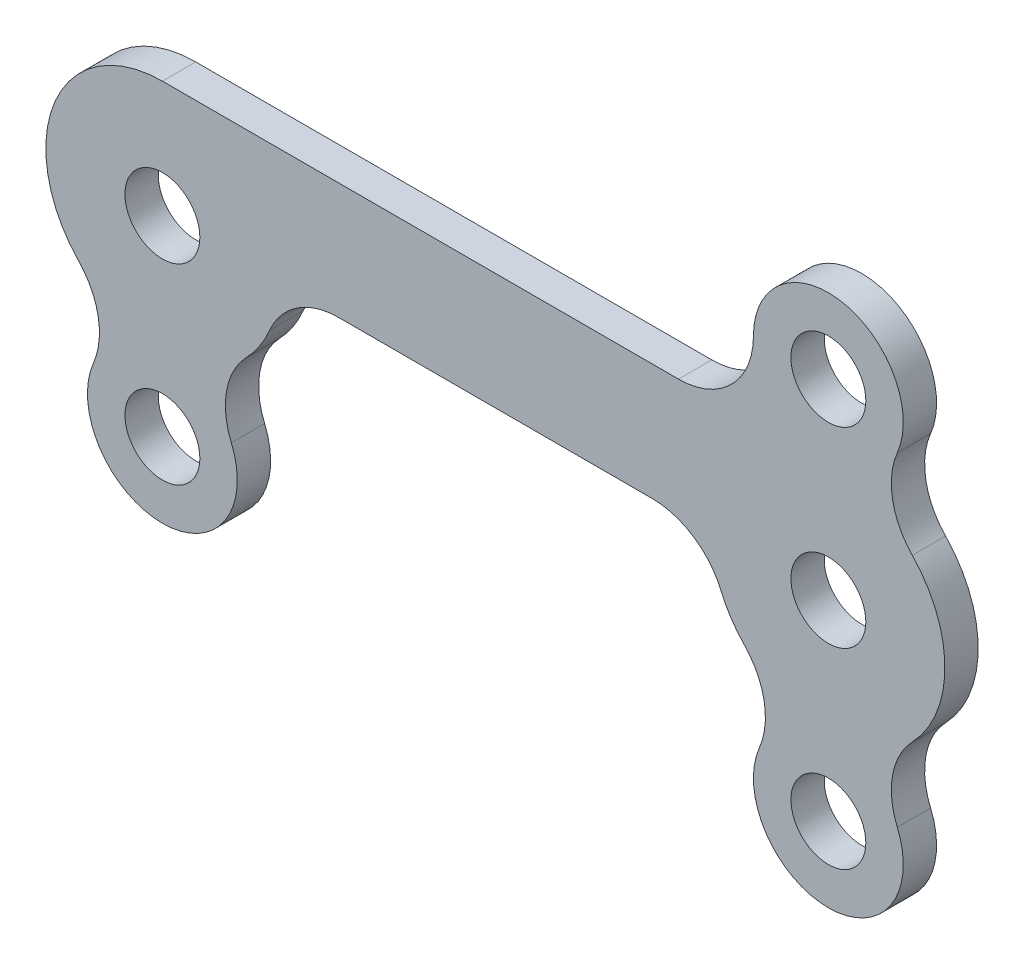
ISO-10303-21;
HEADER;
FILE_DESCRIPTION(('STEP AP214'),'2;1');
FILE_NAME('part.step','',(''),(''),'','','');
FILE_SCHEMA(('AUTOMOTIVE_DESIGN { 1 0 10303 214 1 1 1 1 }'));
ENDSEC;
DATA;
#1=APPLICATION_CONTEXT('core data for automotive mechanical design processes');
#2=APPLICATION_PROTOCOL_DEFINITION('international standard','automotive_design',2000,#1);
#3=PRODUCT_CONTEXT('',#1,'mechanical');
#4=PRODUCT('Part','Part','',(#3));
#5=PRODUCT_RELATED_PRODUCT_CATEGORY('part','',(#4));
#6=PRODUCT_DEFINITION_FORMATION('','',#4);
#7=PRODUCT_DEFINITION_CONTEXT('part definition',#1,'design');
#8=PRODUCT_DEFINITION('design','',#6,#7);
#9=PRODUCT_DEFINITION_SHAPE('','',#8);
#10=(LENGTH_UNIT() NAMED_UNIT(*) SI_UNIT(.MILLI.,.METRE.));
#11=(NAMED_UNIT(*) PLANE_ANGLE_UNIT() SI_UNIT($,.RADIAN.));
#12=(NAMED_UNIT(*) SI_UNIT($,.STERADIAN.) SOLID_ANGLE_UNIT());
#13=UNCERTAINTY_MEASURE_WITH_UNIT(LENGTH_MEASURE(1.E-05),#10,'distance_accuracy_value','');
#14=(GEOMETRIC_REPRESENTATION_CONTEXT(3) GLOBAL_UNCERTAINTY_ASSIGNED_CONTEXT((#13)) GLOBAL_UNIT_ASSIGNED_CONTEXT((#10,
#11,#12)) REPRESENTATION_CONTEXT('',''));
#15=CARTESIAN_POINT('',(0.,0.,0.));
#16=DIRECTION('',(0.,0.,1.));
#17=DIRECTION('',(1.,0.,0.));
#18=AXIS2_PLACEMENT_3D('',#15,#16,#17);
#19=CARTESIAN_POINT('',(38.324116844667,6.33274456521739,1.5875));
#20=DIRECTION('',(0.,0.,-1.));
#21=DIRECTION('',(-1.,0.,0.));
#22=AXIS2_PLACEMENT_3D('',#19,#20,#21);
#23=CYLINDRICAL_SURFACE('',#22,3.571875);
#24=CARTESIAN_POINT('',(38.324116844667,6.33274456521739,0.));
#25=DIRECTION('',(0.,0.,1.));
#26=DIRECTION('',(1.,0.,0.));
#27=AXIS2_PLACEMENT_3D('',#24,#25,#26);
#28=CIRCLE('',#27,3.571875);
#29=CARTESIAN_POINT('',(35.0370584223335,7.7304347826087,0.));
#30=VERTEX_POINT('',#29);
#31=CARTESIAN_POINT('',(35.7516363402321,3.8547140831758,0.));
#32=VERTEX_POINT('',#31);
#33=EDGE_CURVE('E166',#30,#32,#28,.T.);
#34=ORIENTED_EDGE('',*,*,#33,.F.);
#35=DIRECTION('',(0.,0.,-1.));
#36=VECTOR('',#35,1.);
#37=CARTESIAN_POINT('',(35.0370584223335,7.7304347826087,1.5875));
#38=LINE('',#37,#36);
#39=CARTESIAN_POINT('',(35.0370584223335,7.7304347826087,1.5875));
#40=VERTEX_POINT('',#39);
#41=EDGE_CURVE('E161',#40,#30,#38,.T.);
#42=ORIENTED_EDGE('',*,*,#41,.F.);
#43=CARTESIAN_POINT('',(38.324116844667,6.33274456521739,1.5875));
#44=DIRECTION('',(0.,0.,1.));
#45=DIRECTION('',(1.,0.,0.));
#46=AXIS2_PLACEMENT_3D('',#43,#44,#45);
#47=CIRCLE('',#46,3.571875);
#48=CARTESIAN_POINT('',(35.7516363402321,3.8547140831758,1.5875));
#49=VERTEX_POINT('',#48);
#50=EDGE_CURVE('E164',#40,#49,#47,.T.);
#51=ORIENTED_EDGE('',*,*,#50,.T.);
#52=DIRECTION('',(0.,0.,-1.));
#53=VECTOR('',#52,1.);
#54=CARTESIAN_POINT('',(35.7516363402321,3.8547140831758,1.5875));
#55=LINE('',#54,#53);
#56=EDGE_CURVE('E256',#49,#32,#55,.T.);
#57=ORIENTED_EDGE('',*,*,#56,.T.);
#58=EDGE_LOOP('',(#34,#42,#51,#57));
#59=FACE_BOUND('',#58,.T.);
#60=ADVANCED_FACE('F41',(#59),#23,.F.);
#61=CARTESIAN_POINT('',(31.75,9.128125,1.5875));
#62=DIRECTION('',(0.,0.,-1.));
#63=DIRECTION('',(-1.,0.,0.));
#64=AXIS2_PLACEMENT_3D('',#61,#62,#63);
#65=CYLINDRICAL_SURFACE('',#64,3.57187499999999);
#66=CARTESIAN_POINT('',(31.75,9.128125,0.));
#67=DIRECTION('',(0.,0.,1.));
#68=DIRECTION('',(1.,0.,0.));
#69=AXIS2_PLACEMENT_3D('',#66,#67,#68);
#70=CIRCLE('',#69,3.57187499999999);
#71=CARTESIAN_POINT('',(28.178125,9.128125,0.));
#72=VERTEX_POINT('',#71);
#73=EDGE_CURVE('E259',#30,#72,#70,.T.);
#74=ORIENTED_EDGE('',*,*,#73,.T.);
#75=DIRECTION('',(0.,0.,-1.));
#76=VECTOR('',#75,1.);
#77=CARTESIAN_POINT('',(28.178125,9.128125,1.5875));
#78=LINE('',#77,#76);
#79=CARTESIAN_POINT('',(28.178125,9.128125,1.5875));
#80=VERTEX_POINT('',#79);
#81=EDGE_CURVE('E172',#80,#72,#78,.T.);
#82=ORIENTED_EDGE('',*,*,#81,.F.);
#83=CARTESIAN_POINT('',(31.75,9.128125,1.5875));
#84=DIRECTION('',(0.,0.,1.));
#85=DIRECTION('',(1.,0.,0.));
#86=AXIS2_PLACEMENT_3D('',#83,#84,#85);
#87=CIRCLE('',#86,3.57187499999999);
#88=EDGE_CURVE('E175',#40,#80,#87,.T.);
#89=ORIENTED_EDGE('',*,*,#88,.F.);
#90=ORIENTED_EDGE('',*,*,#41,.T.);
#91=EDGE_LOOP('',(#74,#82,#89,#90));
#92=FACE_BOUND('',#91,.T.);
#93=ADVANCED_FACE('F176',(#92),#65,.T.);
#94=CARTESIAN_POINT('',(24.60625,9.128125,1.5875));
#95=DIRECTION('',(0.,0.,-1.));
#96=DIRECTION('',(-1.,0.,0.));
#97=AXIS2_PLACEMENT_3D('',#94,#95,#96);
#98=CYLINDRICAL_SURFACE('',#97,3.571875);
#99=CARTESIAN_POINT('',(24.60625,9.128125,0.));
#100=DIRECTION('',(0.,0.,1.));
#101=DIRECTION('',(1.,0.,0.));
#102=AXIS2_PLACEMENT_3D('',#99,#100,#101);
#103=CIRCLE('',#102,3.571875);
#104=CARTESIAN_POINT('',(24.60625,5.55625,0.));
#105=VERTEX_POINT('',#104);
#106=EDGE_CURVE('E262',#105,#72,#103,.T.);
#107=ORIENTED_EDGE('',*,*,#106,.F.);
#108=DIRECTION('',(0.,0.,-1.));
#109=VECTOR('',#108,1.);
#110=CARTESIAN_POINT('',(24.60625,5.55625,1.5875));
#111=LINE('',#110,#109);
#112=CARTESIAN_POINT('',(24.60625,5.55625,1.5875));
#113=VERTEX_POINT('',#112);
#114=EDGE_CURVE('E352',#113,#105,#111,.T.);
#115=ORIENTED_EDGE('',*,*,#114,.F.);
#116=CARTESIAN_POINT('',(24.60625,9.128125,1.5875));
#117=DIRECTION('',(0.,0.,1.));
#118=DIRECTION('',(1.,0.,0.));
#119=AXIS2_PLACEMENT_3D('',#116,#117,#118);
#120=CIRCLE('',#119,3.571875);
#121=EDGE_CURVE('E181',#113,#80,#120,.T.);
#122=ORIENTED_EDGE('',*,*,#121,.T.);
#123=ORIENTED_EDGE('',*,*,#81,.T.);
#124=EDGE_LOOP('',(#107,#115,#122,#123));
#125=FACE_BOUND('',#124,.T.);
#126=ADVANCED_FACE('F417',(#125),#98,.F.);
#127=CARTESIAN_POINT('',(0.,5.55625,1.5875));
#128=DIRECTION('',(0.,1.,0.));
#129=DIRECTION('',(0.,0.,1.));
#130=AXIS2_PLACEMENT_3D('',#127,#128,#129);
#131=PLANE('',#130);
#132=DIRECTION('',(1.,0.,0.));
#133=VECTOR('',#132,1.);
#134=CARTESIAN_POINT('',(0.,5.55625,0.));
#135=LINE('',#134,#133);
#136=CARTESIAN_POINT('',(0.,5.55625,0.));
#137=VERTEX_POINT('',#136);
#138=EDGE_CURVE('E266',#137,#105,#135,.T.);
#139=ORIENTED_EDGE('',*,*,#138,.F.);
#140=DIRECTION('',(0.,0.,-1.));
#141=VECTOR('',#140,1.);
#142=CARTESIAN_POINT('',(0.,5.55625,1.5875));
#143=LINE('',#142,#141);
#144=CARTESIAN_POINT('',(0.,5.55625,1.5875));
#145=VERTEX_POINT('',#144);
#146=EDGE_CURVE('E349',#145,#137,#143,.T.);
#147=ORIENTED_EDGE('',*,*,#146,.F.);
#148=DIRECTION('',(1.,0.,0.));
#149=VECTOR('',#148,1.);
#150=CARTESIAN_POINT('',(0.,5.55625,1.5875));
#151=LINE('',#150,#149);
#152=EDGE_CURVE('E199',#145,#113,#151,.T.);
#153=ORIENTED_EDGE('',*,*,#152,.T.);
#154=ORIENTED_EDGE('',*,*,#114,.T.);
#155=EDGE_LOOP('',(#139,#147,#153,#154));
#156=FACE_BOUND('',#155,.T.);
#157=ADVANCED_FACE('F420',(#156),#131,.T.);
#158=CARTESIAN_POINT('',(0.,0.,1.5875));
#159=DIRECTION('',(0.,0.,-1.));
#160=DIRECTION('',(-1.,0.,0.));
#161=AXIS2_PLACEMENT_3D('',#158,#159,#160);
#162=CYLINDRICAL_SURFACE('',#161,5.55625);
#163=CARTESIAN_POINT('',(0.,0.,0.));
#164=DIRECTION('',(0.,0.,1.));
#165=DIRECTION('',(1.,0.,0.));
#166=AXIS2_PLACEMENT_3D('',#163,#164,#165);
#167=CIRCLE('',#166,5.55625);
#168=CARTESIAN_POINT('',(-4.0016363402321,-3.85471408317581,0.));
#169=VERTEX_POINT('',#168);
#170=EDGE_CURVE('E270',#137,#169,#167,.T.);
#171=ORIENTED_EDGE('',*,*,#170,.T.);
#172=DIRECTION('',(0.,0.,-1.));
#173=VECTOR('',#172,1.);
#174=CARTESIAN_POINT('',(-4.0016363402321,-3.85471408317581,1.5875));
#175=LINE('',#174,#173);
#176=CARTESIAN_POINT('',(-4.0016363402321,-3.85471408317581,1.5875));
#177=VERTEX_POINT('',#176);
#178=EDGE_CURVE('E346',#177,#169,#175,.T.);
#179=ORIENTED_EDGE('',*,*,#178,.F.);
#180=CARTESIAN_POINT('',(0.,0.,1.5875));
#181=DIRECTION('',(0.,0.,1.));
#182=DIRECTION('',(1.,0.,0.));
#183=AXIS2_PLACEMENT_3D('',#180,#181,#182);
#184=CIRCLE('',#183,5.55625);
#185=EDGE_CURVE('E203',#145,#177,#184,.T.);
#186=ORIENTED_EDGE('',*,*,#185,.F.);
#187=ORIENTED_EDGE('',*,*,#146,.T.);
#188=EDGE_LOOP('',(#171,#179,#186,#187));
#189=FACE_BOUND('',#188,.T.);
#190=ADVANCED_FACE('F424',(#189),#162,.T.);
#191=CARTESIAN_POINT('',(-6.57411684466702,-6.3327445652174,1.5875));
#192=DIRECTION('',(0.,0.,-1.));
#193=DIRECTION('',(-1.,0.,0.));
#194=AXIS2_PLACEMENT_3D('',#191,#192,#193);
#195=CYLINDRICAL_SURFACE('',#194,3.57187499999999);
#196=CARTESIAN_POINT('',(-6.57411684466702,-6.3327445652174,0.));
#197=DIRECTION('',(0.,0.,1.));
#198=DIRECTION('',(1.,0.,0.));
#199=AXIS2_PLACEMENT_3D('',#196,#197,#198);
#200=CIRCLE('',#199,3.57187499999999);
#201=CARTESIAN_POINT('',(-3.2870584223335,-7.7304347826087,0.));
#202=VERTEX_POINT('',#201);
#203=EDGE_CURVE('E274',#202,#169,#200,.T.);
#204=ORIENTED_EDGE('',*,*,#203,.F.);
#205=DIRECTION('',(0.,0.,-1.));
#206=VECTOR('',#205,1.);
#207=CARTESIAN_POINT('',(-3.2870584223335,-7.7304347826087,1.5875));
#208=LINE('',#207,#206);
#209=CARTESIAN_POINT('',(-3.2870584223335,-7.7304347826087,1.5875));
#210=VERTEX_POINT('',#209);
#211=EDGE_CURVE('E343',#210,#202,#208,.T.);
#212=ORIENTED_EDGE('',*,*,#211,.F.);
#213=CARTESIAN_POINT('',(-6.57411684466702,-6.3327445652174,1.5875));
#214=DIRECTION('',(0.,0.,1.));
#215=DIRECTION('',(1.,0.,0.));
#216=AXIS2_PLACEMENT_3D('',#213,#214,#215);
#217=CIRCLE('',#216,3.57187499999999);
#218=EDGE_CURVE('E206',#210,#177,#217,.T.);
#219=ORIENTED_EDGE('',*,*,#218,.T.);
#220=ORIENTED_EDGE('',*,*,#178,.T.);
#221=EDGE_LOOP('',(#204,#212,#219,#220));
#222=FACE_BOUND('',#221,.T.);
#223=ADVANCED_FACE('F430',(#222),#195,.F.);
#224=CARTESIAN_POINT('',(0.,-9.128125,1.5875));
#225=DIRECTION('',(0.,0.,-1.));
#226=DIRECTION('',(-1.,0.,0.));
#227=AXIS2_PLACEMENT_3D('',#224,#225,#226);
#228=CYLINDRICAL_SURFACE('',#227,3.57187499999999);
#229=CARTESIAN_POINT('',(0.,-9.128125,0.));
#230=DIRECTION('',(0.,0.,1.));
#231=DIRECTION('',(1.,0.,0.));
#232=AXIS2_PLACEMENT_3D('',#229,#230,#231);
#233=CIRCLE('',#232,3.57187499999999);
#234=CARTESIAN_POINT('',(3.2870584223335,-7.73043478260869,0.));
#235=VERTEX_POINT('',#234);
#236=EDGE_CURVE('E279',#202,#235,#233,.T.);
#237=ORIENTED_EDGE('',*,*,#236,.T.);
#238=DIRECTION('',(0.,0.,-1.));
#239=VECTOR('',#238,1.);
#240=CARTESIAN_POINT('',(3.2870584223335,-7.73043478260869,1.5875));
#241=LINE('',#240,#239);
#242=CARTESIAN_POINT('',(3.2870584223335,-7.73043478260869,1.5875));
#243=VERTEX_POINT('',#242);
#244=EDGE_CURVE('E340',#243,#235,#241,.T.);
#245=ORIENTED_EDGE('',*,*,#244,.F.);
#246=CARTESIAN_POINT('',(0.,-9.128125,1.5875));
#247=DIRECTION('',(0.,0.,1.));
#248=DIRECTION('',(1.,0.,0.));
#249=AXIS2_PLACEMENT_3D('',#246,#247,#248);
#250=CIRCLE('',#249,3.57187499999999);
#251=EDGE_CURVE('E211',#210,#243,#250,.T.);
#252=ORIENTED_EDGE('',*,*,#251,.F.);
#253=ORIENTED_EDGE('',*,*,#211,.T.);
#254=EDGE_LOOP('',(#237,#245,#252,#253));
#255=FACE_BOUND('',#254,.T.);
#256=ADVANCED_FACE('F433',(#255),#228,.T.);
#257=CARTESIAN_POINT('',(6.57411684466701,-6.33274456521738,1.5875));
#258=DIRECTION('',(0.,0.,-1.));
#259=DIRECTION('',(-1.,0.,0.));
#260=AXIS2_PLACEMENT_3D('',#257,#258,#259);
#261=CYLINDRICAL_SURFACE('',#260,3.57187500000001);
#262=CARTESIAN_POINT('',(6.57411684466701,-6.33274456521738,0.));
#263=DIRECTION('',(0.,0.,1.));
#264=DIRECTION('',(1.,0.,0.));
#265=AXIS2_PLACEMENT_3D('',#262,#263,#264);
#266=CIRCLE('',#265,3.57187500000001);
#267=CARTESIAN_POINT('',(4.0016363402321,-3.8547140831758,0.));
#268=VERTEX_POINT('',#267);
#269=EDGE_CURVE('E283',#268,#235,#266,.T.);
#270=ORIENTED_EDGE('',*,*,#269,.F.);
#271=DIRECTION('',(0.,0.,-1.));
#272=VECTOR('',#271,1.);
#273=CARTESIAN_POINT('',(4.0016363402321,-3.8547140831758,1.5875));
#274=LINE('',#273,#272);
#275=CARTESIAN_POINT('',(4.0016363402321,-3.8547140831758,1.5875));
#276=VERTEX_POINT('',#275);
#277=EDGE_CURVE('E337',#276,#268,#274,.T.);
#278=ORIENTED_EDGE('',*,*,#277,.F.);
#279=CARTESIAN_POINT('',(6.57411684466701,-6.33274456521738,1.5875));
#280=DIRECTION('',(0.,0.,1.));
#281=DIRECTION('',(1.,0.,0.));
#282=AXIS2_PLACEMENT_3D('',#279,#280,#281);
#283=CIRCLE('',#282,3.57187500000001);
#284=EDGE_CURVE('E214',#276,#243,#283,.T.);
#285=ORIENTED_EDGE('',*,*,#284,.T.);
#286=ORIENTED_EDGE('',*,*,#244,.T.);
#287=EDGE_LOOP('',(#270,#278,#285,#286));
#288=FACE_BOUND('',#287,.T.);
#289=ADVANCED_FACE('F436',(#288),#261,.F.);
#290=CARTESIAN_POINT('',(5.11320199029657,-2.1741847826087,0.));
#291=VERTEX_POINT('',#290);
#292=EDGE_CURVE('E275',#268,#291,#167,.T.);
#293=ORIENTED_EDGE('',*,*,#292,.T.);
#294=DIRECTION('',(0.,0.,-1.));
#295=VECTOR('',#294,1.);
#296=CARTESIAN_POINT('',(5.11320199029657,-2.1741847826087,1.5875));
#297=LINE('',#296,#295);
#298=CARTESIAN_POINT('',(5.11320199029657,-2.1741847826087,1.5875));
#299=VERTEX_POINT('',#298);
#300=EDGE_CURVE('E57',#291,#299,#297,.F.);
#301=ORIENTED_EDGE('',*,*,#300,.T.);
#302=EDGE_CURVE('E207',#276,#299,#184,.T.);
#303=ORIENTED_EDGE('',*,*,#302,.F.);
#304=ORIENTED_EDGE('',*,*,#277,.T.);
#305=EDGE_LOOP('',(#293,#301,#303,#304));
#306=FACE_BOUND('',#305,.T.);
#307=ADVANCED_FACE('F437',(#306),#162,.T.);
#308=CARTESIAN_POINT('',(0.,0.,1.5875));
#309=DIRECTION('',(0.,1.,0.));
#310=DIRECTION('',(0.,0.,1.));
#311=AXIS2_PLACEMENT_3D('',#308,#309,#310);
#312=PLANE('',#311);
#313=DIRECTION('',(1.,0.,0.));
#314=VECTOR('',#313,1.);
#315=CARTESIAN_POINT('',(0.,0.,0.));
#316=LINE('',#315,#314);
#317=CARTESIAN_POINT('',(8.40026041263008,0.,0.));
#318=VERTEX_POINT('',#317);
#319=CARTESIAN_POINT('',(23.3497395873699,0.,0.));
#320=VERTEX_POINT('',#319);
#321=EDGE_CURVE('E287',#318,#320,#316,.T.);
#322=ORIENTED_EDGE('',*,*,#321,.T.);
#323=DIRECTION('',(0.,0.,1.));
#324=VECTOR('',#323,1.);
#325=CARTESIAN_POINT('',(23.3497395873699,0.,1.5875));
#326=LINE('',#325,#324);
#327=CARTESIAN_POINT('',(23.3497395873699,0.,1.5875));
#328=VERTEX_POINT('',#327);
#329=EDGE_CURVE('E364',#320,#328,#326,.T.);
#330=ORIENTED_EDGE('',*,*,#329,.T.);
#331=DIRECTION('',(1.,0.,0.));
#332=VECTOR('',#331,1.);
#333=CARTESIAN_POINT('',(0.,0.,1.5875));
#334=LINE('',#333,#332);
#335=CARTESIAN_POINT('',(8.40026041263008,0.,1.5875));
#336=VERTEX_POINT('',#335);
#337=EDGE_CURVE('E218',#336,#328,#334,.T.);
#338=ORIENTED_EDGE('',*,*,#337,.F.);
#339=DIRECTION('',(0.,0.,1.));
#340=VECTOR('',#339,1.);
#341=CARTESIAN_POINT('',(8.40026041263008,0.,0.));
#342=LINE('',#341,#340);
#343=EDGE_CURVE('E360',#336,#318,#342,.F.);
#344=ORIENTED_EDGE('',*,*,#343,.T.);
#345=EDGE_LOOP('',(#322,#330,#338,#344));
#346=FACE_BOUND('',#345,.T.);
#347=ADVANCED_FACE('F383',(#346),#312,.F.);
#348=CARTESIAN_POINT('',(31.75,0.,1.5875));
#349=DIRECTION('',(0.,0.,-1.));
#350=DIRECTION('',(-1.,0.,0.));
#351=AXIS2_PLACEMENT_3D('',#348,#349,#350);
#352=CYLINDRICAL_SURFACE('',#351,5.55625);
#353=CARTESIAN_POINT('',(31.75,0.,1.5875));
#354=DIRECTION('',(0.,0.,1.));
#355=DIRECTION('',(1.,0.,0.));
#356=AXIS2_PLACEMENT_3D('',#353,#354,#355);
#357=CIRCLE('',#356,5.55625);
#358=CARTESIAN_POINT('',(26.6367980097034,-2.17418478260869,1.5875));
#359=VERTEX_POINT('',#358);
#360=CARTESIAN_POINT('',(27.7483636597679,-3.8547140831758,1.5875));
#361=VERTEX_POINT('',#360);
#362=EDGE_CURVE('E222',#359,#361,#357,.T.);
#363=ORIENTED_EDGE('',*,*,#362,.F.);
#364=DIRECTION('',(0.,0.,-1.));
#365=VECTOR('',#364,1.);
#366=CARTESIAN_POINT('',(26.6367980097034,-2.1741847826087,1.5875));
#367=LINE('',#366,#365);
#368=CARTESIAN_POINT('',(26.6367980097034,-2.17418478260869,0.));
#369=VERTEX_POINT('',#368);
#370=EDGE_CURVE('E171',#359,#369,#367,.T.);
#371=ORIENTED_EDGE('',*,*,#370,.T.);
#372=CARTESIAN_POINT('',(31.75,0.,0.));
#373=DIRECTION('',(0.,0.,1.));
#374=DIRECTION('',(1.,0.,0.));
#375=AXIS2_PLACEMENT_3D('',#372,#373,#374);
#376=CIRCLE('',#375,5.55625);
#377=CARTESIAN_POINT('',(27.7483636597679,-3.8547140831758,0.));
#378=VERTEX_POINT('',#377);
#379=EDGE_CURVE('E291',#369,#378,#376,.T.);
#380=ORIENTED_EDGE('',*,*,#379,.T.);
#381=DIRECTION('',(0.,0.,-1.));
#382=VECTOR('',#381,1.);
#383=CARTESIAN_POINT('',(27.7483636597679,-3.8547140831758,1.5875));
#384=LINE('',#383,#382);
#385=EDGE_CURVE('E333',#361,#378,#384,.T.);
#386=ORIENTED_EDGE('',*,*,#385,.F.);
#387=EDGE_LOOP('',(#363,#371,#380,#386));
#388=FACE_BOUND('',#387,.T.);
#389=ADVANCED_FACE('F394',(#388),#352,.T.);
#390=CARTESIAN_POINT('',(25.175883155333,-6.33274456521739,1.5875));
#391=DIRECTION('',(0.,0.,-1.));
#392=DIRECTION('',(-1.,0.,0.));
#393=AXIS2_PLACEMENT_3D('',#390,#391,#392);
#394=CYLINDRICAL_SURFACE('',#393,3.57187499999999);
#395=CARTESIAN_POINT('',(25.175883155333,-6.33274456521739,0.));
#396=DIRECTION('',(0.,0.,1.));
#397=DIRECTION('',(1.,0.,0.));
#398=AXIS2_PLACEMENT_3D('',#395,#396,#397);
#399=CIRCLE('',#398,3.57187499999999);
#400=CARTESIAN_POINT('',(28.4629415776665,-7.7304347826087,0.));
#401=VERTEX_POINT('',#400);
#402=EDGE_CURVE('E294',#401,#378,#399,.T.);
#403=ORIENTED_EDGE('',*,*,#402,.F.);
#404=DIRECTION('',(0.,0.,-1.));
#405=VECTOR('',#404,1.);
#406=CARTESIAN_POINT('',(28.4629415776665,-7.7304347826087,1.5875));
#407=LINE('',#406,#405);
#408=CARTESIAN_POINT('',(28.4629415776665,-7.7304347826087,1.5875));
#409=VERTEX_POINT('',#408);
#410=EDGE_CURVE('E330',#409,#401,#407,.T.);
#411=ORIENTED_EDGE('',*,*,#410,.F.);
#412=CARTESIAN_POINT('',(25.175883155333,-6.33274456521739,1.5875));
#413=DIRECTION('',(0.,0.,1.));
#414=DIRECTION('',(1.,0.,0.));
#415=AXIS2_PLACEMENT_3D('',#412,#413,#414);
#416=CIRCLE('',#415,3.57187499999999);
#417=EDGE_CURVE('E225',#409,#361,#416,.T.);
#418=ORIENTED_EDGE('',*,*,#417,.T.);
#419=ORIENTED_EDGE('',*,*,#385,.T.);
#420=EDGE_LOOP('',(#403,#411,#418,#419));
#421=FACE_BOUND('',#420,.T.);
#422=ADVANCED_FACE('F401',(#421),#394,.F.);
#423=CARTESIAN_POINT('',(31.75,-9.128125,1.5875));
#424=DIRECTION('',(0.,0.,-1.));
#425=DIRECTION('',(-1.,0.,0.));
#426=AXIS2_PLACEMENT_3D('',#423,#424,#425);
#427=CYLINDRICAL_SURFACE('',#426,3.57187499999999);
#428=CARTESIAN_POINT('',(31.75,-9.128125,0.));
#429=DIRECTION('',(0.,0.,1.));
#430=DIRECTION('',(1.,0.,0.));
#431=AXIS2_PLACEMENT_3D('',#428,#429,#430);
#432=CIRCLE('',#431,3.57187499999999);
#433=CARTESIAN_POINT('',(35.0370584223335,-7.7304347826087,0.));
#434=VERTEX_POINT('',#433);
#435=EDGE_CURVE('E299',#401,#434,#432,.T.);
#436=ORIENTED_EDGE('',*,*,#435,.T.);
#437=DIRECTION('',(0.,0.,-1.));
#438=VECTOR('',#437,1.);
#439=CARTESIAN_POINT('',(35.0370584223335,-7.7304347826087,1.5875));
#440=LINE('',#439,#438);
#441=CARTESIAN_POINT('',(35.0370584223335,-7.7304347826087,1.5875));
#442=VERTEX_POINT('',#441);
#443=EDGE_CURVE('E327',#442,#434,#440,.T.);
#444=ORIENTED_EDGE('',*,*,#443,.F.);
#445=CARTESIAN_POINT('',(31.75,-9.128125,1.5875));
#446=DIRECTION('',(0.,0.,1.));
#447=DIRECTION('',(1.,0.,0.));
#448=AXIS2_PLACEMENT_3D('',#445,#446,#447);
#449=CIRCLE('',#448,3.57187499999999);
#450=EDGE_CURVE('E229',#409,#442,#449,.T.);
#451=ORIENTED_EDGE('',*,*,#450,.F.);
#452=ORIENTED_EDGE('',*,*,#410,.T.);
#453=EDGE_LOOP('',(#436,#444,#451,#452));
#454=FACE_BOUND('',#453,.T.);
#455=ADVANCED_FACE('F404',(#454),#427,.T.);
#456=CARTESIAN_POINT('',(38.324116844667,-6.33274456521739,1.5875));
#457=DIRECTION('',(0.,0.,-1.));
#458=DIRECTION('',(-1.,0.,0.));
#459=AXIS2_PLACEMENT_3D('',#456,#457,#458);
#460=CYLINDRICAL_SURFACE('',#459,3.571875);
#461=CARTESIAN_POINT('',(38.324116844667,-6.33274456521739,0.));
#462=DIRECTION('',(0.,0.,1.));
#463=DIRECTION('',(1.,0.,0.));
#464=AXIS2_PLACEMENT_3D('',#461,#462,#463);
#465=CIRCLE('',#464,3.571875);
#466=CARTESIAN_POINT('',(35.7516363402321,-3.8547140831758,0.));
#467=VERTEX_POINT('',#466);
#468=EDGE_CURVE('E303',#467,#434,#465,.T.);
#469=ORIENTED_EDGE('',*,*,#468,.F.);
#470=DIRECTION('',(0.,0.,-1.));
#471=VECTOR('',#470,1.);
#472=CARTESIAN_POINT('',(35.7516363402321,-3.8547140831758,1.5875));
#473=LINE('',#472,#471);
#474=CARTESIAN_POINT('',(35.7516363402321,-3.8547140831758,1.5875));
#475=VERTEX_POINT('',#474);
#476=EDGE_CURVE('E324',#475,#467,#473,.T.);
#477=ORIENTED_EDGE('',*,*,#476,.F.);
#478=CARTESIAN_POINT('',(38.324116844667,-6.33274456521739,1.5875));
#479=DIRECTION('',(0.,0.,1.));
#480=DIRECTION('',(1.,0.,0.));
#481=AXIS2_PLACEMENT_3D('',#478,#479,#480);
#482=CIRCLE('',#481,3.571875);
#483=EDGE_CURVE('E232',#475,#442,#482,.T.);
#484=ORIENTED_EDGE('',*,*,#483,.T.);
#485=ORIENTED_EDGE('',*,*,#443,.T.);
#486=EDGE_LOOP('',(#469,#477,#484,#485));
#487=FACE_BOUND('',#486,.T.);
#488=ADVANCED_FACE('F407',(#487),#460,.F.);
#489=CARTESIAN_POINT('',(31.75,9.128125,1.5875));
#490=DIRECTION('',(0.,0.,-1.));
#491=DIRECTION('',(-1.,0.,0.));
#492=AXIS2_PLACEMENT_3D('',#489,#490,#491);
#493=CYLINDRICAL_SURFACE('',#492,1.7859375);
#494=CARTESIAN_POINT('',(31.75,9.128125,1.5875));
#495=DIRECTION('',(0.,0.,1.));
#496=DIRECTION('',(1.,0.,0.));
#497=AXIS2_PLACEMENT_3D('',#494,#495,#496);
#498=CIRCLE('',#497,1.7859375);
#499=CARTESIAN_POINT('',(33.5359375,9.128125,1.5875));
#500=VERTEX_POINT('',#499);
#501=EDGE_CURVE('E248',#500,#500,#498,.T.);
#502=ORIENTED_EDGE('',*,*,#501,.T.);
#503=EDGE_LOOP('',(#502));
#504=FACE_BOUND('',#503,.T.);
#505=CARTESIAN_POINT('',(31.75,9.128125,0.));
#506=DIRECTION('',(0.,0.,1.));
#507=DIRECTION('',(1.,0.,0.));
#508=AXIS2_PLACEMENT_3D('',#505,#506,#507);
#509=CIRCLE('',#508,1.7859375);
#510=CARTESIAN_POINT('',(33.5359375,9.128125,0.));
#511=VERTEX_POINT('',#510);
#512=EDGE_CURVE('E194',#511,#511,#509,.T.);
#513=ORIENTED_EDGE('',*,*,#512,.F.);
#514=EDGE_LOOP('',(#513));
#515=FACE_BOUND('',#514,.T.);
#516=ADVANCED_FACE('F470',(#504,#515),#493,.F.);
#517=CARTESIAN_POINT('',(31.75,0.,1.5875));
#518=DIRECTION('',(0.,0.,-1.));
#519=DIRECTION('',(-1.,0.,0.));
#520=AXIS2_PLACEMENT_3D('',#517,#518,#519);
#521=CYLINDRICAL_SURFACE('',#520,1.7859375);
#522=CARTESIAN_POINT('',(31.75,0.,1.5875));
#523=DIRECTION('',(0.,0.,1.));
#524=DIRECTION('',(1.,0.,0.));
#525=AXIS2_PLACEMENT_3D('',#522,#523,#524);
#526=CIRCLE('',#525,1.7859375);
#527=CARTESIAN_POINT('',(33.5359375,0.,1.5875));
#528=VERTEX_POINT('',#527);
#529=EDGE_CURVE('E244',#528,#528,#526,.T.);
#530=ORIENTED_EDGE('',*,*,#529,.T.);
#531=EDGE_LOOP('',(#530));
#532=FACE_BOUND('',#531,.T.);
#533=CARTESIAN_POINT('',(31.75,0.,0.));
#534=DIRECTION('',(0.,0.,1.));
#535=DIRECTION('',(1.,0.,0.));
#536=AXIS2_PLACEMENT_3D('',#533,#534,#535);
#537=CIRCLE('',#536,1.7859375);
#538=CARTESIAN_POINT('',(33.5359375,0.,0.));
#539=VERTEX_POINT('',#538);
#540=EDGE_CURVE('E315',#539,#539,#537,.T.);
#541=ORIENTED_EDGE('',*,*,#540,.F.);
#542=EDGE_LOOP('',(#541));
#543=FACE_BOUND('',#542,.T.);
#544=ADVANCED_FACE('F473',(#532,#543),#521,.F.);
#545=CARTESIAN_POINT('',(0.,0.,1.5875));
#546=DIRECTION('',(0.,0.,-1.));
#547=DIRECTION('',(-1.,0.,0.));
#548=AXIS2_PLACEMENT_3D('',#545,#546,#547);
#549=CYLINDRICAL_SURFACE('',#548,1.7859375);
#550=CARTESIAN_POINT('',(0.,0.,1.5875));
#551=DIRECTION('',(0.,0.,1.));
#552=DIRECTION('',(1.,0.,0.));
#553=AXIS2_PLACEMENT_3D('',#550,#551,#552);
#554=CIRCLE('',#553,1.7859375);
#555=CARTESIAN_POINT('',(1.7859375,0.,1.5875));
#556=VERTEX_POINT('',#555);
#557=EDGE_CURVE('E240',#556,#556,#554,.T.);
#558=ORIENTED_EDGE('',*,*,#557,.T.);
#559=EDGE_LOOP('',(#558));
#560=FACE_BOUND('',#559,.T.);
#561=CARTESIAN_POINT('',(0.,0.,0.));
#562=DIRECTION('',(0.,0.,1.));
#563=DIRECTION('',(1.,0.,0.));
#564=AXIS2_PLACEMENT_3D('',#561,#562,#563);
#565=CIRCLE('',#564,1.7859375);
#566=CARTESIAN_POINT('',(1.7859375,0.,0.));
#567=VERTEX_POINT('',#566);
#568=EDGE_CURVE('E311',#567,#567,#565,.T.);
#569=ORIENTED_EDGE('',*,*,#568,.F.);
#570=EDGE_LOOP('',(#569));
#571=FACE_BOUND('',#570,.T.);
#572=ADVANCED_FACE('F477',(#560,#571),#549,.F.);
#573=CARTESIAN_POINT('',(0.,-9.128125,1.5875));
#574=DIRECTION('',(0.,0.,-1.));
#575=DIRECTION('',(-1.,0.,0.));
#576=AXIS2_PLACEMENT_3D('',#573,#574,#575);
#577=CYLINDRICAL_SURFACE('',#576,1.7859375);
#578=CARTESIAN_POINT('',(0.,-9.128125,1.5875));
#579=DIRECTION('',(0.,0.,1.));
#580=DIRECTION('',(1.,0.,0.));
#581=AXIS2_PLACEMENT_3D('',#578,#579,#580);
#582=CIRCLE('',#581,1.7859375);
#583=CARTESIAN_POINT('',(1.7859375,-9.128125,1.5875));
#584=VERTEX_POINT('',#583);
#585=EDGE_CURVE('E236',#584,#584,#582,.T.);
#586=ORIENTED_EDGE('',*,*,#585,.T.);
#587=EDGE_LOOP('',(#586));
#588=FACE_BOUND('',#587,.T.);
#589=CARTESIAN_POINT('',(0.,-9.128125,0.));
#590=DIRECTION('',(0.,0.,1.));
#591=DIRECTION('',(1.,0.,0.));
#592=AXIS2_PLACEMENT_3D('',#589,#590,#591);
#593=CIRCLE('',#592,1.7859375);
#594=CARTESIAN_POINT('',(1.7859375,-9.128125,0.));
#595=VERTEX_POINT('',#594);
#596=EDGE_CURVE('E307',#595,#595,#593,.T.);
#597=ORIENTED_EDGE('',*,*,#596,.F.);
#598=EDGE_LOOP('',(#597));
#599=FACE_BOUND('',#598,.T.);
#600=ADVANCED_FACE('F481',(#588,#599),#577,.F.);
#601=EDGE_CURVE('E295',#467,#32,#376,.T.);
#602=ORIENTED_EDGE('',*,*,#601,.T.);
#603=ORIENTED_EDGE('',*,*,#56,.F.);
#604=EDGE_CURVE('E187',#475,#49,#357,.T.);
#605=ORIENTED_EDGE('',*,*,#604,.F.);
#606=ORIENTED_EDGE('',*,*,#476,.T.);
#607=EDGE_LOOP('',(#602,#603,#605,#606));
#608=FACE_BOUND('',#607,.T.);
#609=ADVANCED_FACE('F411',(#608),#352,.T.);
#610=CARTESIAN_POINT('',(31.75,-9.128125,1.5875));
#611=DIRECTION('',(0.,0.,-1.));
#612=DIRECTION('',(-1.,0.,0.));
#613=AXIS2_PLACEMENT_3D('',#610,#611,#612);
#614=CYLINDRICAL_SURFACE('',#613,1.7859375);
#615=CARTESIAN_POINT('',(31.75,-9.128125,1.5875));
#616=DIRECTION('',(0.,0.,1.));
#617=DIRECTION('',(1.,0.,0.));
#618=AXIS2_PLACEMENT_3D('',#615,#616,#617);
#619=CIRCLE('',#618,1.7859375);
#620=CARTESIAN_POINT('',(33.5359375,-9.128125,1.5875));
#621=VERTEX_POINT('',#620);
#622=EDGE_CURVE('E252',#621,#621,#619,.T.);
#623=ORIENTED_EDGE('',*,*,#622,.T.);
#624=EDGE_LOOP('',(#623));
#625=FACE_BOUND('',#624,.T.);
#626=CARTESIAN_POINT('',(31.75,-9.128125,0.));
#627=DIRECTION('',(0.,0.,1.));
#628=DIRECTION('',(1.,0.,0.));
#629=AXIS2_PLACEMENT_3D('',#626,#627,#628);
#630=CIRCLE('',#629,1.7859375);
#631=CARTESIAN_POINT('',(33.5359375,-9.128125,0.));
#632=VERTEX_POINT('',#631);
#633=EDGE_CURVE('E190',#632,#632,#630,.T.);
#634=ORIENTED_EDGE('',*,*,#633,.F.);
#635=EDGE_LOOP('',(#634));
#636=FACE_BOUND('',#635,.T.);
#637=ADVANCED_FACE('F464',(#625,#636),#614,.F.);
#638=CARTESIAN_POINT('',(0.,0.,1.5875));
#639=DIRECTION('',(0.,0.,1.));
#640=DIRECTION('',(1.,0.,0.));
#641=AXIS2_PLACEMENT_3D('',#638,#639,#640);
#642=PLANE('',#641);
#643=ORIENTED_EDGE('',*,*,#50,.F.);
#644=ORIENTED_EDGE('',*,*,#88,.T.);
#645=ORIENTED_EDGE('',*,*,#121,.F.);
#646=ORIENTED_EDGE('',*,*,#152,.F.);
#647=ORIENTED_EDGE('',*,*,#185,.T.);
#648=ORIENTED_EDGE('',*,*,#218,.F.);
#649=ORIENTED_EDGE('',*,*,#251,.T.);
#650=ORIENTED_EDGE('',*,*,#284,.F.);
#651=ORIENTED_EDGE('',*,*,#302,.T.);
#652=CARTESIAN_POINT('',(8.40026041263008,-3.571875,1.5875));
#653=DIRECTION('',(0.,0.,1.));
#654=DIRECTION('',(1.,0.,0.));
#655=AXIS2_PLACEMENT_3D('',#652,#653,#654);
#656=CIRCLE('',#655,3.571875);
#657=EDGE_CURVE('E11',#299,#336,#656,.F.);
#658=ORIENTED_EDGE('',*,*,#657,.T.);
#659=ORIENTED_EDGE('',*,*,#337,.T.);
#660=CARTESIAN_POINT('',(23.3497395873699,-3.571875,1.5875));
#661=DIRECTION('',(0.,0.,1.));
#662=DIRECTION('',(1.,0.,0.));
#663=AXIS2_PLACEMENT_3D('',#660,#661,#662);
#664=CIRCLE('',#663,3.571875);
#665=EDGE_CURVE('E372',#328,#359,#664,.F.);
#666=ORIENTED_EDGE('',*,*,#665,.T.);
#667=ORIENTED_EDGE('',*,*,#362,.T.);
#668=ORIENTED_EDGE('',*,*,#417,.F.);
#669=ORIENTED_EDGE('',*,*,#450,.T.);
#670=ORIENTED_EDGE('',*,*,#483,.F.);
#671=ORIENTED_EDGE('',*,*,#604,.T.);
#672=EDGE_LOOP('',(#643,#644,#645,#646,#647,#648,#649,#650,#651,#658,#659,#666,#667,#668,#669,
#670,#671));
#673=FACE_BOUND('',#672,.T.);
#674=ORIENTED_EDGE('',*,*,#585,.F.);
#675=EDGE_LOOP('',(#674));
#676=FACE_BOUND('',#675,.T.);
#677=ORIENTED_EDGE('',*,*,#557,.F.);
#678=EDGE_LOOP('',(#677));
#679=FACE_BOUND('',#678,.T.);
#680=ORIENTED_EDGE('',*,*,#529,.F.);
#681=EDGE_LOOP('',(#680));
#682=FACE_BOUND('',#681,.T.);
#683=ORIENTED_EDGE('',*,*,#501,.F.);
#684=EDGE_LOOP('',(#683));
#685=FACE_BOUND('',#684,.T.);
#686=ORIENTED_EDGE('',*,*,#622,.F.);
#687=EDGE_LOOP('',(#686));
#688=FACE_BOUND('',#687,.T.);
#689=ADVANCED_FACE('F183',(#673,#676,#679,#682,#685,#688),#642,.T.);
#690=CARTESIAN_POINT('',(0.,0.,0.));
#691=DIRECTION('',(0.,0.,1.));
#692=DIRECTION('',(1.,0.,0.));
#693=AXIS2_PLACEMENT_3D('',#690,#691,#692);
#694=PLANE('',#693);
#695=ORIENTED_EDGE('',*,*,#33,.T.);
#696=ORIENTED_EDGE('',*,*,#601,.F.);
#697=ORIENTED_EDGE('',*,*,#468,.T.);
#698=ORIENTED_EDGE('',*,*,#435,.F.);
#699=ORIENTED_EDGE('',*,*,#402,.T.);
#700=ORIENTED_EDGE('',*,*,#379,.F.);
#701=CARTESIAN_POINT('',(23.3497395873699,-3.571875,0.));
#702=DIRECTION('',(0.,0.,1.));
#703=DIRECTION('',(1.,0.,0.));
#704=AXIS2_PLACEMENT_3D('',#701,#702,#703);
#705=CIRCLE('',#704,3.571875);
#706=EDGE_CURVE('E369',#369,#320,#705,.T.);
#707=ORIENTED_EDGE('',*,*,#706,.T.);
#708=ORIENTED_EDGE('',*,*,#321,.F.);
#709=CARTESIAN_POINT('',(8.40026041263008,-3.571875,0.));
#710=DIRECTION('',(0.,0.,1.));
#711=DIRECTION('',(1.,0.,0.));
#712=AXIS2_PLACEMENT_3D('',#709,#710,#711);
#713=CIRCLE('',#712,3.571875);
#714=EDGE_CURVE('E50',#318,#291,#713,.T.);
#715=ORIENTED_EDGE('',*,*,#714,.T.);
#716=ORIENTED_EDGE('',*,*,#292,.F.);
#717=ORIENTED_EDGE('',*,*,#269,.T.);
#718=ORIENTED_EDGE('',*,*,#236,.F.);
#719=ORIENTED_EDGE('',*,*,#203,.T.);
#720=ORIENTED_EDGE('',*,*,#170,.F.);
#721=ORIENTED_EDGE('',*,*,#138,.T.);
#722=ORIENTED_EDGE('',*,*,#106,.T.);
#723=ORIENTED_EDGE('',*,*,#73,.F.);
#724=EDGE_LOOP('',(#695,#696,#697,#698,#699,#700,#707,#708,#715,#716,#717,#718,#719,#720,#721,
#722,#723));
#725=FACE_BOUND('',#724,.T.);
#726=ORIENTED_EDGE('',*,*,#596,.T.);
#727=EDGE_LOOP('',(#726));
#728=FACE_BOUND('',#727,.T.);
#729=ORIENTED_EDGE('',*,*,#568,.T.);
#730=EDGE_LOOP('',(#729));
#731=FACE_BOUND('',#730,.T.);
#732=ORIENTED_EDGE('',*,*,#540,.T.);
#733=EDGE_LOOP('',(#732));
#734=FACE_BOUND('',#733,.T.);
#735=ORIENTED_EDGE('',*,*,#512,.T.);
#736=EDGE_LOOP('',(#735));
#737=FACE_BOUND('',#736,.T.);
#738=ORIENTED_EDGE('',*,*,#633,.T.);
#739=EDGE_LOOP('',(#738));
#740=FACE_BOUND('',#739,.T.);
#741=ADVANCED_FACE('F385',(#725,#728,#731,#734,#737,#740),#694,.F.);
#742=CARTESIAN_POINT('',(23.3497395873699,-3.571875,1.5875));
#743=DIRECTION('',(0.,0.,-1.));
#744=DIRECTION('',(-1.,0.,0.));
#745=AXIS2_PLACEMENT_3D('',#742,#743,#744);
#746=CYLINDRICAL_SURFACE('',#745,3.571875);
#747=ORIENTED_EDGE('',*,*,#665,.F.);
#748=ORIENTED_EDGE('',*,*,#329,.F.);
#749=ORIENTED_EDGE('',*,*,#706,.F.);
#750=ORIENTED_EDGE('',*,*,#370,.F.);
#751=EDGE_LOOP('',(#747,#748,#749,#750));
#752=FACE_BOUND('',#751,.T.);
#753=ADVANCED_FACE('F391',(#752),#746,.F.);
#754=CARTESIAN_POINT('',(8.40026041263008,-3.571875,1.5875));
#755=DIRECTION('',(0.,0.,-1.));
#756=DIRECTION('',(-1.,0.,0.));
#757=AXIS2_PLACEMENT_3D('',#754,#755,#756);
#758=CYLINDRICAL_SURFACE('',#757,3.571875);
#759=ORIENTED_EDGE('',*,*,#657,.F.);
#760=ORIENTED_EDGE('',*,*,#300,.F.);
#761=ORIENTED_EDGE('',*,*,#714,.F.);
#762=ORIENTED_EDGE('',*,*,#343,.F.);
#763=EDGE_LOOP('',(#759,#760,#761,#762));
#764=FACE_BOUND('',#763,.T.);
#765=ADVANCED_FACE('F43',(#764),#758,.F.);
#766=CLOSED_SHELL('',(#60,#93,#126,#157,#190,#223,#256,#289,#307,#347,#389,#422,#455,#488,#516,
#544,#572,#600,#609,#637,#689,#741,#753,#765));
#767=MANIFOLD_SOLID_BREP('B2',#766);
#768=ADVANCED_BREP_SHAPE_REPRESENTATION('',(#18,#767),#14);
#769=SHAPE_DEFINITION_REPRESENTATION(#9,#768);
ENDSEC;
END-ISO-10303-21;
